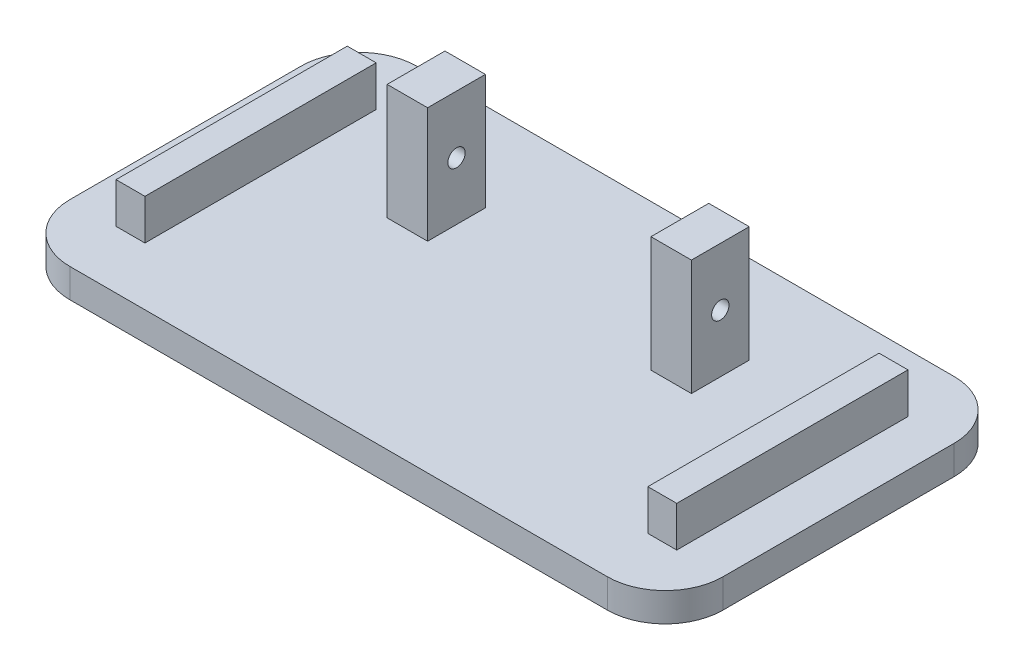
ISO-10303-21;
HEADER;
FILE_DESCRIPTION(('STEP AP214'),'2;1');
FILE_NAME('part.step','',(''),(''),'','','');
FILE_SCHEMA(('AUTOMOTIVE_DESIGN { 1 0 10303 214 1 1 1 1 }'));
ENDSEC;
DATA;
#1=APPLICATION_CONTEXT('core data for automotive mechanical design processes');
#2=APPLICATION_PROTOCOL_DEFINITION('international standard','automotive_design',2000,#1);
#3=PRODUCT_CONTEXT('',#1,'mechanical');
#4=PRODUCT('Part','Part','',(#3));
#5=PRODUCT_RELATED_PRODUCT_CATEGORY('part','',(#4));
#6=PRODUCT_DEFINITION_FORMATION('','',#4);
#7=PRODUCT_DEFINITION_CONTEXT('part definition',#1,'design');
#8=PRODUCT_DEFINITION('design','',#6,#7);
#9=PRODUCT_DEFINITION_SHAPE('','',#8);
#10=(LENGTH_UNIT() NAMED_UNIT(*) SI_UNIT(.MILLI.,.METRE.));
#11=(NAMED_UNIT(*) PLANE_ANGLE_UNIT() SI_UNIT($,.RADIAN.));
#12=(NAMED_UNIT(*) SI_UNIT($,.STERADIAN.) SOLID_ANGLE_UNIT());
#13=UNCERTAINTY_MEASURE_WITH_UNIT(LENGTH_MEASURE(1.E-05),#10,'distance_accuracy_value','');
#14=(GEOMETRIC_REPRESENTATION_CONTEXT(3) GLOBAL_UNCERTAINTY_ASSIGNED_CONTEXT((#13)) GLOBAL_UNIT_ASSIGNED_CONTEXT((#10,
#11,#12)) REPRESENTATION_CONTEXT('',''));
#15=CARTESIAN_POINT('',(0.,0.,0.));
#16=DIRECTION('',(0.,0.,1.));
#17=DIRECTION('',(1.,0.,0.));
#18=AXIS2_PLACEMENT_3D('',#15,#16,#17);
#19=CARTESIAN_POINT('',(79.785498489426,5.,-5.53323262839879));
#20=DIRECTION('',(0.,1.,0.));
#21=DIRECTION('',(0.,0.,1.));
#22=AXIS2_PLACEMENT_3D('',#19,#20,#21);
#23=PLANE('',#22);
#24=CARTESIAN_POINT('',(79.785498489426,5.,-5.53323262839879));
#25=DIRECTION('',(0.,1.,0.));
#26=DIRECTION('',(0.,0.,1.));
#27=AXIS2_PLACEMENT_3D('',#24,#25,#26);
#28=CIRCLE('',#27,10.);
#29=CARTESIAN_POINT('',(89.785498489426,5.,-5.53323262839872));
#30=VERTEX_POINT('',#29);
#31=CARTESIAN_POINT('',(79.7854984894259,5.,-15.5332326283988));
#32=VERTEX_POINT('',#31);
#33=EDGE_CURVE('E320',#30,#32,#28,.T.);
#34=ORIENTED_EDGE('',*,*,#33,.T.);
#35=DIRECTION('',(-1.,0.,0.));
#36=VECTOR('',#35,1.);
#37=CARTESIAN_POINT('',(-13.214501510574,5.,-15.5332326283988));
#38=LINE('',#37,#36);
#39=CARTESIAN_POINT('',(-13.214501510574,5.,-15.5332326283988));
#40=VERTEX_POINT('',#39);
#41=EDGE_CURVE('E323',#32,#40,#38,.T.);
#42=ORIENTED_EDGE('',*,*,#41,.T.);
#43=CARTESIAN_POINT('',(-13.214501510574,5.,-5.5332326283988));
#44=DIRECTION('',(0.,1.,0.));
#45=DIRECTION('',(0.,0.,-1.));
#46=AXIS2_PLACEMENT_3D('',#43,#44,#45);
#47=CIRCLE('',#46,10.);
#48=CARTESIAN_POINT('',(-23.214501510574,5.,-5.53323262839872));
#49=VERTEX_POINT('',#48);
#50=EDGE_CURVE('E326',#40,#49,#47,.T.);
#51=ORIENTED_EDGE('',*,*,#50,.T.);
#52=DIRECTION('',(0.,0.,1.));
#53=VECTOR('',#52,1.);
#54=CARTESIAN_POINT('',(-23.214501510574,5.,-5.53323262839872));
#55=LINE('',#54,#53);
#56=CARTESIAN_POINT('',(-23.214501510574,5.,34.4667673716011));
#57=VERTEX_POINT('',#56);
#58=EDGE_CURVE('E328',#49,#57,#55,.T.);
#59=ORIENTED_EDGE('',*,*,#58,.T.);
#60=CARTESIAN_POINT('',(-13.214501510574,5.,34.4667673716012));
#61=DIRECTION('',(0.,1.,0.));
#62=DIRECTION('',(0.,0.,-1.));
#63=AXIS2_PLACEMENT_3D('',#60,#61,#62);
#64=CIRCLE('',#63,10.);
#65=CARTESIAN_POINT('',(-13.214501510574,5.,44.4667673716012));
#66=VERTEX_POINT('',#65);
#67=EDGE_CURVE('E330',#57,#66,#64,.T.);
#68=ORIENTED_EDGE('',*,*,#67,.T.);
#69=DIRECTION('',(1.,0.,0.));
#70=VECTOR('',#69,1.);
#71=CARTESIAN_POINT('',(-13.214501510574,5.,44.4667673716012));
#72=LINE('',#71,#70);
#73=CARTESIAN_POINT('',(79.7854984894259,5.,44.4667673716012));
#74=VERTEX_POINT('',#73);
#75=EDGE_CURVE('E332',#66,#74,#72,.T.);
#76=ORIENTED_EDGE('',*,*,#75,.T.);
#77=CARTESIAN_POINT('',(79.785498489426,5.,34.4667673716012));
#78=DIRECTION('',(0.,1.,0.));
#79=DIRECTION('',(0.,0.,-1.));
#80=AXIS2_PLACEMENT_3D('',#77,#78,#79);
#81=CIRCLE('',#80,10.);
#82=CARTESIAN_POINT('',(89.785498489426,5.,34.4667673716011));
#83=VERTEX_POINT('',#82);
#84=EDGE_CURVE('E334',#74,#83,#81,.T.);
#85=ORIENTED_EDGE('',*,*,#84,.T.);
#86=DIRECTION('',(0.,0.,-1.));
#87=VECTOR('',#86,1.);
#88=CARTESIAN_POINT('',(89.785498489426,5.,-5.53323262839872));
#89=LINE('',#88,#87);
#90=EDGE_CURVE('E336',#83,#30,#89,.T.);
#91=ORIENTED_EDGE('',*,*,#90,.T.);
#92=EDGE_LOOP('',(#34,#42,#51,#59,#68,#76,#85,#91));
#93=FACE_BOUND('',#92,.T.);
#94=DIRECTION('',(1.,0.,0.));
#95=VECTOR('',#94,1.);
#96=CARTESIAN_POINT('',(6.96549848942598,5.,9.74755716237041));
#97=LINE('',#96,#95);
#98=CARTESIAN_POINT('',(6.96549848942598,5.,9.74755716237041));
#99=VERTEX_POINT('',#98);
#100=CARTESIAN_POINT('',(13.965498489426,5.,9.74755716237041));
#101=VERTEX_POINT('',#100);
#102=EDGE_CURVE('E304',#99,#101,#97,.T.);
#103=ORIENTED_EDGE('',*,*,#102,.F.);
#104=DIRECTION('',(0.,0.,1.));
#105=VECTOR('',#104,1.);
#106=CARTESIAN_POINT('',(6.96549848942598,5.,-0.252442837629588));
#107=LINE('',#106,#105);
#108=CARTESIAN_POINT('',(6.96549848942598,5.,-0.252442837629588));
#109=VERTEX_POINT('',#108);
#110=EDGE_CURVE('E290',#109,#99,#107,.T.);
#111=ORIENTED_EDGE('',*,*,#110,.F.);
#112=DIRECTION('',(-1.,0.,0.));
#113=VECTOR('',#112,1.);
#114=CARTESIAN_POINT('',(6.96549848942598,5.,-0.252442837629588));
#115=LINE('',#114,#113);
#116=CARTESIAN_POINT('',(13.965498489426,5.,-0.252442837629588));
#117=VERTEX_POINT('',#116);
#118=EDGE_CURVE('E295',#117,#109,#115,.T.);
#119=ORIENTED_EDGE('',*,*,#118,.F.);
#120=DIRECTION('',(0.,0.,-1.));
#121=VECTOR('',#120,1.);
#122=CARTESIAN_POINT('',(13.965498489426,5.,-0.252442837629588));
#123=LINE('',#122,#121);
#124=EDGE_CURVE('E306',#101,#117,#123,.T.);
#125=ORIENTED_EDGE('',*,*,#124,.F.);
#126=EDGE_LOOP('',(#103,#111,#119,#125));
#127=FACE_BOUND('',#126,.T.);
#128=DIRECTION('',(0.,0.,1.));
#129=VECTOR('',#128,1.);
#130=CARTESIAN_POINT('',(52.605498489426,5.,-0.252442837629588));
#131=LINE('',#130,#129);
#132=CARTESIAN_POINT('',(52.605498489426,5.,-0.252442837629588));
#133=VERTEX_POINT('',#132);
#134=CARTESIAN_POINT('',(52.605498489426,5.,9.74755716237041));
#135=VERTEX_POINT('',#134);
#136=EDGE_CURVE('E275',#133,#135,#131,.T.);
#137=ORIENTED_EDGE('',*,*,#136,.F.);
#138=DIRECTION('',(-1.,0.,0.));
#139=VECTOR('',#138,1.);
#140=CARTESIAN_POINT('',(52.605498489426,5.,-0.252442837629588));
#141=LINE('',#140,#139);
#142=CARTESIAN_POINT('',(59.605498489426,5.,-0.252442837629588));
#143=VERTEX_POINT('',#142);
#144=EDGE_CURVE('E261',#143,#133,#141,.T.);
#145=ORIENTED_EDGE('',*,*,#144,.F.);
#146=DIRECTION('',(0.,0.,-1.));
#147=VECTOR('',#146,1.);
#148=CARTESIAN_POINT('',(59.605498489426,5.,-0.252442837629588));
#149=LINE('',#148,#147);
#150=CARTESIAN_POINT('',(59.605498489426,5.,9.74755716237041));
#151=VERTEX_POINT('',#150);
#152=EDGE_CURVE('E266',#151,#143,#149,.T.);
#153=ORIENTED_EDGE('',*,*,#152,.F.);
#154=DIRECTION('',(1.,0.,0.));
#155=VECTOR('',#154,1.);
#156=CARTESIAN_POINT('',(52.605498489426,5.,9.74755716237041));
#157=LINE('',#156,#155);
#158=EDGE_CURVE('E277',#135,#151,#157,.T.);
#159=ORIENTED_EDGE('',*,*,#158,.F.);
#160=EDGE_LOOP('',(#137,#145,#153,#159));
#161=FACE_BOUND('',#160,.T.);
#162=DIRECTION('',(1.,0.,0.));
#163=VECTOR('',#162,1.);
#164=CARTESIAN_POINT('',(-15.214501510574,5.,34.4667673716012));
#165=LINE('',#164,#163);
#166=CARTESIAN_POINT('',(-15.214501510574,5.,34.4667673716012));
#167=VERTEX_POINT('',#166);
#168=CARTESIAN_POINT('',(-10.214501510574,5.,34.4667673716012));
#169=VERTEX_POINT('',#168);
#170=EDGE_CURVE('E224',#167,#169,#165,.T.);
#171=ORIENTED_EDGE('',*,*,#170,.F.);
#172=DIRECTION('',(0.,0.,1.));
#173=VECTOR('',#172,1.);
#174=CARTESIAN_POINT('',(-15.214501510574,5.,-5.5332326283988));
#175=LINE('',#174,#173);
#176=CARTESIAN_POINT('',(-15.214501510574,5.,-5.5332326283988));
#177=VERTEX_POINT('',#176);
#178=EDGE_CURVE('E221',#177,#167,#175,.T.);
#179=ORIENTED_EDGE('',*,*,#178,.F.);
#180=DIRECTION('',(-1.,0.,0.));
#181=VECTOR('',#180,1.);
#182=CARTESIAN_POINT('',(-15.214501510574,5.,-5.5332326283988));
#183=LINE('',#182,#181);
#184=CARTESIAN_POINT('',(-10.214501510574,5.,-5.5332326283988));
#185=VERTEX_POINT('',#184);
#186=EDGE_CURVE('E233',#185,#177,#183,.T.);
#187=ORIENTED_EDGE('',*,*,#186,.F.);
#188=DIRECTION('',(0.,0.,-1.));
#189=VECTOR('',#188,1.);
#190=CARTESIAN_POINT('',(-10.214501510574,5.,-5.5332326283988));
#191=LINE('',#190,#189);
#192=EDGE_CURVE('E241',#169,#185,#191,.T.);
#193=ORIENTED_EDGE('',*,*,#192,.F.);
#194=EDGE_LOOP('',(#171,#179,#187,#193));
#195=FACE_BOUND('',#194,.T.);
#196=DIRECTION('',(1.,0.,0.));
#197=VECTOR('',#196,1.);
#198=CARTESIAN_POINT('',(76.785498489426,5.,34.4667673716012));
#199=LINE('',#198,#197);
#200=CARTESIAN_POINT('',(76.785498489426,5.,34.4667673716012));
#201=VERTEX_POINT('',#200);
#202=CARTESIAN_POINT('',(81.785498489426,5.,34.4667673716012));
#203=VERTEX_POINT('',#202);
#204=EDGE_CURVE('E709',#201,#203,#199,.T.);
#205=ORIENTED_EDGE('',*,*,#204,.F.);
#206=DIRECTION('',(0.,0.,1.));
#207=VECTOR('',#206,1.);
#208=CARTESIAN_POINT('',(76.7854984894259,5.,-5.5332326283988));
#209=LINE('',#208,#207);
#210=CARTESIAN_POINT('',(76.7854984894259,5.,-5.5332326283988));
#211=VERTEX_POINT('',#210);
#212=EDGE_CURVE('E219',#211,#201,#209,.T.);
#213=ORIENTED_EDGE('',*,*,#212,.F.);
#214=DIRECTION('',(-1.,0.,0.));
#215=VECTOR('',#214,1.);
#216=CARTESIAN_POINT('',(76.7854984894259,5.,-5.5332326283988));
#217=LINE('',#216,#215);
#218=CARTESIAN_POINT('',(81.785498489426,5.,-5.5332326283988));
#219=VERTEX_POINT('',#218);
#220=EDGE_CURVE('E215',#219,#211,#217,.T.);
#221=ORIENTED_EDGE('',*,*,#220,.F.);
#222=DIRECTION('',(0.,0.,-1.));
#223=VECTOR('',#222,1.);
#224=CARTESIAN_POINT('',(81.785498489426,5.,-5.5332326283988));
#225=LINE('',#224,#223);
#226=EDGE_CURVE('E706',#203,#219,#225,.T.);
#227=ORIENTED_EDGE('',*,*,#226,.F.);
#228=EDGE_LOOP('',(#205,#213,#221,#227));
#229=FACE_BOUND('',#228,.T.);
#230=ADVANCED_FACE('F33',(#93,#127,#161,#195,#229),#23,.T.);
#231=CARTESIAN_POINT('',(79.785498489426,5.,-5.53323262839879));
#232=DIRECTION('',(0.,-1.,0.));
#233=DIRECTION('',(0.,0.,-1.));
#234=AXIS2_PLACEMENT_3D('',#231,#232,#233);
#235=CYLINDRICAL_SURFACE('',#234,10.);
#236=CARTESIAN_POINT('',(79.785498489426,0.,-5.53323262839879));
#237=DIRECTION('',(0.,1.,0.));
#238=DIRECTION('',(0.,0.,1.));
#239=AXIS2_PLACEMENT_3D('',#236,#237,#238);
#240=CIRCLE('',#239,10.);
#241=CARTESIAN_POINT('',(89.785498489426,0.,-5.53323262839872));
#242=VERTEX_POINT('',#241);
#243=CARTESIAN_POINT('',(79.7854984894259,0.,-15.5332326283988));
#244=VERTEX_POINT('',#243);
#245=EDGE_CURVE('E319',#242,#244,#240,.T.);
#246=ORIENTED_EDGE('',*,*,#245,.T.);
#247=DIRECTION('',(0.,-1.,0.));
#248=VECTOR('',#247,1.);
#249=CARTESIAN_POINT('',(79.7854984894259,5.,-15.5332326283988));
#250=LINE('',#249,#248);
#251=EDGE_CURVE('E11',#32,#244,#250,.T.);
#252=ORIENTED_EDGE('',*,*,#251,.F.);
#253=ORIENTED_EDGE('',*,*,#33,.F.);
#254=DIRECTION('',(0.,-1.,0.));
#255=VECTOR('',#254,1.);
#256=CARTESIAN_POINT('',(89.785498489426,5.,-5.53323262839872));
#257=LINE('',#256,#255);
#258=EDGE_CURVE('E338',#30,#242,#257,.T.);
#259=ORIENTED_EDGE('',*,*,#258,.T.);
#260=EDGE_LOOP('',(#246,#252,#253,#259));
#261=FACE_BOUND('',#260,.T.);
#262=ADVANCED_FACE('F35',(#261),#235,.T.);
#263=CARTESIAN_POINT('',(-13.214501510574,5.,-15.5332326283988));
#264=DIRECTION('',(0.,0.,1.));
#265=DIRECTION('',(1.,0.,0.));
#266=AXIS2_PLACEMENT_3D('',#263,#264,#265);
#267=PLANE('',#266);
#268=DIRECTION('',(-1.,0.,0.));
#269=VECTOR('',#268,1.);
#270=CARTESIAN_POINT('',(-13.214501510574,0.,-15.5332326283988));
#271=LINE('',#270,#269);
#272=CARTESIAN_POINT('',(-13.214501510574,0.,-15.5332326283988));
#273=VERTEX_POINT('',#272);
#274=EDGE_CURVE('E341',#244,#273,#271,.T.);
#275=ORIENTED_EDGE('',*,*,#274,.T.);
#276=DIRECTION('',(0.,-1.,0.));
#277=VECTOR('',#276,1.);
#278=CARTESIAN_POINT('',(-13.214501510574,5.,-15.5332326283988));
#279=LINE('',#278,#277);
#280=EDGE_CURVE('E42',#40,#273,#279,.T.);
#281=ORIENTED_EDGE('',*,*,#280,.F.);
#282=ORIENTED_EDGE('',*,*,#41,.F.);
#283=ORIENTED_EDGE('',*,*,#251,.T.);
#284=EDGE_LOOP('',(#275,#281,#282,#283));
#285=FACE_BOUND('',#284,.T.);
#286=ADVANCED_FACE('F399',(#285),#267,.F.);
#287=CARTESIAN_POINT('',(-13.214501510574,5.,-5.5332326283988));
#288=DIRECTION('',(0.,-1.,0.));
#289=DIRECTION('',(0.,0.,-1.));
#290=AXIS2_PLACEMENT_3D('',#287,#288,#289);
#291=CYLINDRICAL_SURFACE('',#290,10.);
#292=CARTESIAN_POINT('',(-13.214501510574,0.,-5.5332326283988));
#293=DIRECTION('',(0.,1.,0.));
#294=DIRECTION('',(0.,0.,-1.));
#295=AXIS2_PLACEMENT_3D('',#292,#293,#294);
#296=CIRCLE('',#295,10.);
#297=CARTESIAN_POINT('',(-23.214501510574,0.,-5.53323262839872));
#298=VERTEX_POINT('',#297);
#299=EDGE_CURVE('E343',#273,#298,#296,.T.);
#300=ORIENTED_EDGE('',*,*,#299,.T.);
#301=DIRECTION('',(0.,-1.,0.));
#302=VECTOR('',#301,1.);
#303=CARTESIAN_POINT('',(-23.214501510574,5.,-5.53323262839872));
#304=LINE('',#303,#302);
#305=EDGE_CURVE('E368',#49,#298,#304,.T.);
#306=ORIENTED_EDGE('',*,*,#305,.F.);
#307=ORIENTED_EDGE('',*,*,#50,.F.);
#308=ORIENTED_EDGE('',*,*,#280,.T.);
#309=EDGE_LOOP('',(#300,#306,#307,#308));
#310=FACE_BOUND('',#309,.T.);
#311=ADVANCED_FACE('F376',(#310),#291,.T.);
#312=CARTESIAN_POINT('',(-23.214501510574,5.,-5.53323262839872));
#313=DIRECTION('',(1.,0.,0.));
#314=DIRECTION('',(0.,0.,-1.));
#315=AXIS2_PLACEMENT_3D('',#312,#313,#314);
#316=PLANE('',#315);
#317=DIRECTION('',(0.,0.,1.));
#318=VECTOR('',#317,1.);
#319=CARTESIAN_POINT('',(-23.214501510574,0.,-5.53323262839872));
#320=LINE('',#319,#318);
#321=CARTESIAN_POINT('',(-23.214501510574,0.,34.4667673716011));
#322=VERTEX_POINT('',#321);
#323=EDGE_CURVE('E345',#298,#322,#320,.T.);
#324=ORIENTED_EDGE('',*,*,#323,.T.);
#325=DIRECTION('',(0.,-1.,0.));
#326=VECTOR('',#325,1.);
#327=CARTESIAN_POINT('',(-23.214501510574,5.,34.4667673716011));
#328=LINE('',#327,#326);
#329=EDGE_CURVE('E365',#57,#322,#328,.T.);
#330=ORIENTED_EDGE('',*,*,#329,.F.);
#331=ORIENTED_EDGE('',*,*,#58,.F.);
#332=ORIENTED_EDGE('',*,*,#305,.T.);
#333=EDGE_LOOP('',(#324,#330,#331,#332));
#334=FACE_BOUND('',#333,.T.);
#335=ADVANCED_FACE('F387',(#334),#316,.F.);
#336=CARTESIAN_POINT('',(-13.214501510574,5.,34.4667673716012));
#337=DIRECTION('',(0.,-1.,0.));
#338=DIRECTION('',(0.,0.,-1.));
#339=AXIS2_PLACEMENT_3D('',#336,#337,#338);
#340=CYLINDRICAL_SURFACE('',#339,10.);
#341=CARTESIAN_POINT('',(-13.214501510574,0.,34.4667673716012));
#342=DIRECTION('',(0.,1.,0.));
#343=DIRECTION('',(0.,0.,-1.));
#344=AXIS2_PLACEMENT_3D('',#341,#342,#343);
#345=CIRCLE('',#344,10.);
#346=CARTESIAN_POINT('',(-13.214501510574,0.,44.4667673716012));
#347=VERTEX_POINT('',#346);
#348=EDGE_CURVE('E347',#322,#347,#345,.T.);
#349=ORIENTED_EDGE('',*,*,#348,.T.);
#350=DIRECTION('',(0.,-1.,0.));
#351=VECTOR('',#350,1.);
#352=CARTESIAN_POINT('',(-13.214501510574,5.,44.4667673716012));
#353=LINE('',#352,#351);
#354=EDGE_CURVE('E362',#66,#347,#353,.T.);
#355=ORIENTED_EDGE('',*,*,#354,.F.);
#356=ORIENTED_EDGE('',*,*,#67,.F.);
#357=ORIENTED_EDGE('',*,*,#329,.T.);
#358=EDGE_LOOP('',(#349,#355,#356,#357));
#359=FACE_BOUND('',#358,.T.);
#360=ADVANCED_FACE('F391',(#359),#340,.T.);
#361=CARTESIAN_POINT('',(-13.214501510574,5.,44.4667673716012));
#362=DIRECTION('',(0.,0.,-1.));
#363=DIRECTION('',(-1.,0.,0.));
#364=AXIS2_PLACEMENT_3D('',#361,#362,#363);
#365=PLANE('',#364);
#366=DIRECTION('',(1.,0.,0.));
#367=VECTOR('',#366,1.);
#368=CARTESIAN_POINT('',(-13.214501510574,0.,44.4667673716012));
#369=LINE('',#368,#367);
#370=CARTESIAN_POINT('',(79.7854984894259,0.,44.4667673716012));
#371=VERTEX_POINT('',#370);
#372=EDGE_CURVE('E349',#347,#371,#369,.T.);
#373=ORIENTED_EDGE('',*,*,#372,.T.);
#374=DIRECTION('',(0.,-1.,0.));
#375=VECTOR('',#374,1.);
#376=CARTESIAN_POINT('',(79.7854984894259,5.,44.4667673716012));
#377=LINE('',#376,#375);
#378=EDGE_CURVE('E359',#74,#371,#377,.T.);
#379=ORIENTED_EDGE('',*,*,#378,.F.);
#380=ORIENTED_EDGE('',*,*,#75,.F.);
#381=ORIENTED_EDGE('',*,*,#354,.T.);
#382=EDGE_LOOP('',(#373,#379,#380,#381));
#383=FACE_BOUND('',#382,.T.);
#384=ADVANCED_FACE('F412',(#383),#365,.F.);
#385=CARTESIAN_POINT('',(79.785498489426,5.,34.4667673716012));
#386=DIRECTION('',(0.,-1.,0.));
#387=DIRECTION('',(0.,0.,-1.));
#388=AXIS2_PLACEMENT_3D('',#385,#386,#387);
#389=CYLINDRICAL_SURFACE('',#388,10.);
#390=CARTESIAN_POINT('',(79.785498489426,0.,34.4667673716012));
#391=DIRECTION('',(0.,1.,0.));
#392=DIRECTION('',(0.,0.,-1.));
#393=AXIS2_PLACEMENT_3D('',#390,#391,#392);
#394=CIRCLE('',#393,10.);
#395=CARTESIAN_POINT('',(89.785498489426,0.,34.4667673716011));
#396=VERTEX_POINT('',#395);
#397=EDGE_CURVE('E351',#371,#396,#394,.T.);
#398=ORIENTED_EDGE('',*,*,#397,.T.);
#399=DIRECTION('',(0.,-1.,0.));
#400=VECTOR('',#399,1.);
#401=CARTESIAN_POINT('',(89.785498489426,5.,34.4667673716011));
#402=LINE('',#401,#400);
#403=EDGE_CURVE('E356',#83,#396,#402,.T.);
#404=ORIENTED_EDGE('',*,*,#403,.F.);
#405=ORIENTED_EDGE('',*,*,#84,.F.);
#406=ORIENTED_EDGE('',*,*,#378,.T.);
#407=EDGE_LOOP('',(#398,#404,#405,#406));
#408=FACE_BOUND('',#407,.T.);
#409=ADVANCED_FACE('F410',(#408),#389,.T.);
#410=CARTESIAN_POINT('',(89.785498489426,5.,-5.53323262839872));
#411=DIRECTION('',(-1.,0.,0.));
#412=DIRECTION('',(0.,0.,1.));
#413=AXIS2_PLACEMENT_3D('',#410,#411,#412);
#414=PLANE('',#413);
#415=DIRECTION('',(0.,0.,-1.));
#416=VECTOR('',#415,1.);
#417=CARTESIAN_POINT('',(89.785498489426,0.,-5.53323262839872));
#418=LINE('',#417,#416);
#419=EDGE_CURVE('E324',#396,#242,#418,.T.);
#420=ORIENTED_EDGE('',*,*,#419,.T.);
#421=ORIENTED_EDGE('',*,*,#258,.F.);
#422=ORIENTED_EDGE('',*,*,#90,.F.);
#423=ORIENTED_EDGE('',*,*,#403,.T.);
#424=EDGE_LOOP('',(#420,#421,#422,#423));
#425=FACE_BOUND('',#424,.T.);
#426=ADVANCED_FACE('F405',(#425),#414,.F.);
#427=CARTESIAN_POINT('',(79.785498489426,0.,-5.53323262839879));
#428=DIRECTION('',(0.,1.,0.));
#429=DIRECTION('',(0.,0.,1.));
#430=AXIS2_PLACEMENT_3D('',#427,#428,#429);
#431=PLANE('',#430);
#432=ORIENTED_EDGE('',*,*,#245,.F.);
#433=ORIENTED_EDGE('',*,*,#419,.F.);
#434=ORIENTED_EDGE('',*,*,#397,.F.);
#435=ORIENTED_EDGE('',*,*,#372,.F.);
#436=ORIENTED_EDGE('',*,*,#348,.F.);
#437=ORIENTED_EDGE('',*,*,#323,.F.);
#438=ORIENTED_EDGE('',*,*,#299,.F.);
#439=ORIENTED_EDGE('',*,*,#274,.F.);
#440=EDGE_LOOP('',(#432,#433,#434,#435,#436,#437,#438,#439));
#441=FACE_BOUND('',#440,.T.);
#442=ADVANCED_FACE('F382',(#441),#431,.F.);
#443=CARTESIAN_POINT('',(6.96549848942598,25.,-0.252442837629588));
#444=DIRECTION('',(1.,0.,0.));
#445=DIRECTION('',(0.,0.,-1.));
#446=AXIS2_PLACEMENT_3D('',#443,#444,#445);
#447=PLANE('',#446);
#448=CARTESIAN_POINT('',(6.96549848942598,15.,4.74755716237041));
#449=DIRECTION('',(-1.,0.,0.));
#450=DIRECTION('',(0.,0.,1.));
#451=AXIS2_PLACEMENT_3D('',#448,#449,#450);
#452=CIRCLE('',#451,1.5);
#453=CARTESIAN_POINT('',(6.96549848942597,15.,6.24755716237041));
#454=VERTEX_POINT('',#453);
#455=EDGE_CURVE('E252',#454,#454,#452,.T.);
#456=ORIENTED_EDGE('',*,*,#455,.F.);
#457=EDGE_LOOP('',(#456));
#458=FACE_BOUND('',#457,.T.);
#459=ORIENTED_EDGE('',*,*,#110,.T.);
#460=DIRECTION('',(0.,-1.,0.));
#461=VECTOR('',#460,1.);
#462=CARTESIAN_POINT('',(6.96549848942598,25.,9.74755716237041));
#463=LINE('',#462,#461);
#464=CARTESIAN_POINT('',(6.96549848942598,25.,9.74755716237041));
#465=VERTEX_POINT('',#464);
#466=EDGE_CURVE('E317',#465,#99,#463,.T.);
#467=ORIENTED_EDGE('',*,*,#466,.F.);
#468=DIRECTION('',(0.,0.,1.));
#469=VECTOR('',#468,1.);
#470=CARTESIAN_POINT('',(6.96549848942598,25.,-0.252442837629588));
#471=LINE('',#470,#469);
#472=CARTESIAN_POINT('',(6.96549848942598,25.,-0.252442837629588));
#473=VERTEX_POINT('',#472);
#474=EDGE_CURVE('E291',#473,#465,#471,.T.);
#475=ORIENTED_EDGE('',*,*,#474,.F.);
#476=DIRECTION('',(0.,-1.,0.));
#477=VECTOR('',#476,1.);
#478=CARTESIAN_POINT('',(6.96549848942598,25.,-0.252442837629588));
#479=LINE('',#478,#477);
#480=EDGE_CURVE('E301',#473,#109,#479,.T.);
#481=ORIENTED_EDGE('',*,*,#480,.T.);
#482=EDGE_LOOP('',(#459,#467,#475,#481));
#483=FACE_BOUND('',#482,.T.);
#484=ADVANCED_FACE('F428',(#458,#483),#447,.F.);
#485=CARTESIAN_POINT('',(6.96549848942598,25.,9.74755716237041));
#486=DIRECTION('',(0.,0.,-1.));
#487=DIRECTION('',(-1.,0.,0.));
#488=AXIS2_PLACEMENT_3D('',#485,#486,#487);
#489=PLANE('',#488);
#490=ORIENTED_EDGE('',*,*,#102,.T.);
#491=DIRECTION('',(0.,-1.,0.));
#492=VECTOR('',#491,1.);
#493=CARTESIAN_POINT('',(13.965498489426,25.,9.74755716237041));
#494=LINE('',#493,#492);
#495=CARTESIAN_POINT('',(13.965498489426,25.,9.74755716237041));
#496=VERTEX_POINT('',#495);
#497=EDGE_CURVE('E314',#496,#101,#494,.T.);
#498=ORIENTED_EDGE('',*,*,#497,.F.);
#499=DIRECTION('',(1.,0.,0.));
#500=VECTOR('',#499,1.);
#501=CARTESIAN_POINT('',(6.96549848942598,25.,9.74755716237041));
#502=LINE('',#501,#500);
#503=EDGE_CURVE('E294',#465,#496,#502,.T.);
#504=ORIENTED_EDGE('',*,*,#503,.F.);
#505=ORIENTED_EDGE('',*,*,#466,.T.);
#506=EDGE_LOOP('',(#490,#498,#504,#505));
#507=FACE_BOUND('',#506,.T.);
#508=ADVANCED_FACE('F448',(#507),#489,.F.);
#509=CARTESIAN_POINT('',(13.965498489426,25.,-0.252442837629588));
#510=DIRECTION('',(-1.,0.,0.));
#511=DIRECTION('',(0.,0.,1.));
#512=AXIS2_PLACEMENT_3D('',#509,#510,#511);
#513=PLANE('',#512);
#514=CARTESIAN_POINT('',(13.965498489426,15.,4.74755716237041));
#515=DIRECTION('',(-1.,0.,0.));
#516=DIRECTION('',(0.,0.,1.));
#517=AXIS2_PLACEMENT_3D('',#514,#515,#516);
#518=CIRCLE('',#517,1.5);
#519=CARTESIAN_POINT('',(13.965498489426,15.,6.24755716237041));
#520=VERTEX_POINT('',#519);
#521=EDGE_CURVE('E258',#520,#520,#518,.T.);
#522=ORIENTED_EDGE('',*,*,#521,.T.);
#523=EDGE_LOOP('',(#522));
#524=FACE_BOUND('',#523,.T.);
#525=ORIENTED_EDGE('',*,*,#124,.T.);
#526=DIRECTION('',(0.,-1.,0.));
#527=VECTOR('',#526,1.);
#528=CARTESIAN_POINT('',(13.965498489426,25.,-0.252442837629588));
#529=LINE('',#528,#527);
#530=CARTESIAN_POINT('',(13.965498489426,25.,-0.252442837629588));
#531=VERTEX_POINT('',#530);
#532=EDGE_CURVE('E312',#531,#117,#529,.T.);
#533=ORIENTED_EDGE('',*,*,#532,.F.);
#534=DIRECTION('',(0.,0.,-1.));
#535=VECTOR('',#534,1.);
#536=CARTESIAN_POINT('',(13.965498489426,25.,-0.252442837629588));
#537=LINE('',#536,#535);
#538=EDGE_CURVE('E297',#496,#531,#537,.T.);
#539=ORIENTED_EDGE('',*,*,#538,.F.);
#540=ORIENTED_EDGE('',*,*,#497,.T.);
#541=EDGE_LOOP('',(#525,#533,#539,#540));
#542=FACE_BOUND('',#541,.T.);
#543=ADVANCED_FACE('F456',(#524,#542),#513,.F.);
#544=CARTESIAN_POINT('',(6.96549848942598,25.,-0.252442837629588));
#545=DIRECTION('',(0.,0.,1.));
#546=DIRECTION('',(1.,0.,0.));
#547=AXIS2_PLACEMENT_3D('',#544,#545,#546);
#548=PLANE('',#547);
#549=ORIENTED_EDGE('',*,*,#118,.T.);
#550=ORIENTED_EDGE('',*,*,#480,.F.);
#551=DIRECTION('',(-1.,0.,0.));
#552=VECTOR('',#551,1.);
#553=CARTESIAN_POINT('',(6.96549848942598,25.,-0.252442837629588));
#554=LINE('',#553,#552);
#555=EDGE_CURVE('E299',#531,#473,#554,.T.);
#556=ORIENTED_EDGE('',*,*,#555,.F.);
#557=ORIENTED_EDGE('',*,*,#532,.T.);
#558=EDGE_LOOP('',(#549,#550,#556,#557));
#559=FACE_BOUND('',#558,.T.);
#560=ADVANCED_FACE('F463',(#559),#548,.F.);
#561=CARTESIAN_POINT('',(0.,25.,0.));
#562=DIRECTION('',(0.,1.,0.));
#563=DIRECTION('',(0.,0.,1.));
#564=AXIS2_PLACEMENT_3D('',#561,#562,#563);
#565=PLANE('',#564);
#566=ORIENTED_EDGE('',*,*,#474,.T.);
#567=ORIENTED_EDGE('',*,*,#503,.T.);
#568=ORIENTED_EDGE('',*,*,#538,.T.);
#569=ORIENTED_EDGE('',*,*,#555,.T.);
#570=EDGE_LOOP('',(#566,#567,#568,#569));
#571=FACE_BOUND('',#570,.T.);
#572=ADVANCED_FACE('F471',(#571),#565,.T.);
#573=CARTESIAN_POINT('',(52.605498489426,25.,-0.252442837629588));
#574=DIRECTION('',(0.,0.,1.));
#575=DIRECTION('',(1.,0.,0.));
#576=AXIS2_PLACEMENT_3D('',#573,#574,#575);
#577=PLANE('',#576);
#578=ORIENTED_EDGE('',*,*,#144,.T.);
#579=DIRECTION('',(0.,-1.,0.));
#580=VECTOR('',#579,1.);
#581=CARTESIAN_POINT('',(52.605498489426,25.,-0.252442837629588));
#582=LINE('',#581,#580);
#583=CARTESIAN_POINT('',(52.605498489426,25.,-0.252442837629588));
#584=VERTEX_POINT('',#583);
#585=EDGE_CURVE('E288',#584,#133,#582,.T.);
#586=ORIENTED_EDGE('',*,*,#585,.F.);
#587=DIRECTION('',(-1.,0.,0.));
#588=VECTOR('',#587,1.);
#589=CARTESIAN_POINT('',(52.605498489426,25.,-0.252442837629588));
#590=LINE('',#589,#588);
#591=CARTESIAN_POINT('',(59.605498489426,25.,-0.252442837629588));
#592=VERTEX_POINT('',#591);
#593=EDGE_CURVE('E262',#592,#584,#590,.T.);
#594=ORIENTED_EDGE('',*,*,#593,.F.);
#595=DIRECTION('',(0.,-1.,0.));
#596=VECTOR('',#595,1.);
#597=CARTESIAN_POINT('',(59.605498489426,25.,-0.252442837629588));
#598=LINE('',#597,#596);
#599=EDGE_CURVE('E272',#592,#143,#598,.T.);
#600=ORIENTED_EDGE('',*,*,#599,.T.);
#601=EDGE_LOOP('',(#578,#586,#594,#600));
#602=FACE_BOUND('',#601,.T.);
#603=ADVANCED_FACE('F479',(#602),#577,.F.);
#604=CARTESIAN_POINT('',(52.605498489426,25.,-0.252442837629588));
#605=DIRECTION('',(1.,0.,0.));
#606=DIRECTION('',(0.,0.,-1.));
#607=AXIS2_PLACEMENT_3D('',#604,#605,#606);
#608=PLANE('',#607);
#609=CARTESIAN_POINT('',(52.605498489426,15.,4.74755716237041));
#610=DIRECTION('',(1.,0.,0.));
#611=DIRECTION('',(0.,0.,-1.));
#612=AXIS2_PLACEMENT_3D('',#609,#610,#611);
#613=CIRCLE('',#612,1.5);
#614=CARTESIAN_POINT('',(52.605498489426,15.,6.24755716237041));
#615=VERTEX_POINT('',#614);
#616=EDGE_CURVE('E255',#615,#615,#613,.T.);
#617=ORIENTED_EDGE('',*,*,#616,.T.);
#618=EDGE_LOOP('',(#617));
#619=FACE_BOUND('',#618,.T.);
#620=ORIENTED_EDGE('',*,*,#136,.T.);
#621=DIRECTION('',(0.,-1.,0.));
#622=VECTOR('',#621,1.);
#623=CARTESIAN_POINT('',(52.605498489426,25.,9.74755716237041));
#624=LINE('',#623,#622);
#625=CARTESIAN_POINT('',(52.605498489426,25.,9.74755716237041));
#626=VERTEX_POINT('',#625);
#627=EDGE_CURVE('E285',#626,#135,#624,.T.);
#628=ORIENTED_EDGE('',*,*,#627,.F.);
#629=DIRECTION('',(0.,0.,1.));
#630=VECTOR('',#629,1.);
#631=CARTESIAN_POINT('',(52.605498489426,25.,-0.252442837629588));
#632=LINE('',#631,#630);
#633=EDGE_CURVE('E265',#584,#626,#632,.T.);
#634=ORIENTED_EDGE('',*,*,#633,.F.);
#635=ORIENTED_EDGE('',*,*,#585,.T.);
#636=EDGE_LOOP('',(#620,#628,#634,#635));
#637=FACE_BOUND('',#636,.T.);
#638=ADVANCED_FACE('F487',(#619,#637),#608,.F.);
#639=CARTESIAN_POINT('',(52.605498489426,25.,9.74755716237041));
#640=DIRECTION('',(0.,0.,-1.));
#641=DIRECTION('',(-1.,0.,0.));
#642=AXIS2_PLACEMENT_3D('',#639,#640,#641);
#643=PLANE('',#642);
#644=ORIENTED_EDGE('',*,*,#158,.T.);
#645=DIRECTION('',(0.,-1.,0.));
#646=VECTOR('',#645,1.);
#647=CARTESIAN_POINT('',(59.605498489426,25.,9.74755716237041));
#648=LINE('',#647,#646);
#649=CARTESIAN_POINT('',(59.605498489426,25.,9.74755716237041));
#650=VERTEX_POINT('',#649);
#651=EDGE_CURVE('E283',#650,#151,#648,.T.);
#652=ORIENTED_EDGE('',*,*,#651,.F.);
#653=DIRECTION('',(1.,0.,0.));
#654=VECTOR('',#653,1.);
#655=CARTESIAN_POINT('',(52.605498489426,25.,9.74755716237041));
#656=LINE('',#655,#654);
#657=EDGE_CURVE('E268',#626,#650,#656,.T.);
#658=ORIENTED_EDGE('',*,*,#657,.F.);
#659=ORIENTED_EDGE('',*,*,#627,.T.);
#660=EDGE_LOOP('',(#644,#652,#658,#659));
#661=FACE_BOUND('',#660,.T.);
#662=ADVANCED_FACE('F495',(#661),#643,.F.);
#663=CARTESIAN_POINT('',(59.605498489426,25.,-0.252442837629588));
#664=DIRECTION('',(-1.,0.,0.));
#665=DIRECTION('',(0.,0.,1.));
#666=AXIS2_PLACEMENT_3D('',#663,#664,#665);
#667=PLANE('',#666);
#668=CARTESIAN_POINT('',(59.605498489426,15.,4.74755716237041));
#669=DIRECTION('',(-1.,0.,0.));
#670=DIRECTION('',(0.,0.,1.));
#671=AXIS2_PLACEMENT_3D('',#668,#669,#670);
#672=CIRCLE('',#671,1.5);
#673=CARTESIAN_POINT('',(59.605498489426,15.,6.24755716237041));
#674=VERTEX_POINT('',#673);
#675=EDGE_CURVE('E37',#674,#674,#672,.T.);
#676=ORIENTED_EDGE('',*,*,#675,.T.);
#677=EDGE_LOOP('',(#676));
#678=FACE_BOUND('',#677,.T.);
#679=ORIENTED_EDGE('',*,*,#152,.T.);
#680=ORIENTED_EDGE('',*,*,#599,.F.);
#681=DIRECTION('',(0.,0.,-1.));
#682=VECTOR('',#681,1.);
#683=CARTESIAN_POINT('',(59.605498489426,25.,-0.252442837629588));
#684=LINE('',#683,#682);
#685=EDGE_CURVE('E270',#650,#592,#684,.T.);
#686=ORIENTED_EDGE('',*,*,#685,.F.);
#687=ORIENTED_EDGE('',*,*,#651,.T.);
#688=EDGE_LOOP('',(#679,#680,#686,#687));
#689=FACE_BOUND('',#688,.T.);
#690=ADVANCED_FACE('F503',(#678,#689),#667,.F.);
#691=CARTESIAN_POINT('',(0.,25.,0.));
#692=DIRECTION('',(0.,-1.,0.));
#693=DIRECTION('',(0.,0.,-1.));
#694=AXIS2_PLACEMENT_3D('',#691,#692,#693);
#695=PLANE('',#694);
#696=ORIENTED_EDGE('',*,*,#593,.T.);
#697=ORIENTED_EDGE('',*,*,#633,.T.);
#698=ORIENTED_EDGE('',*,*,#657,.T.);
#699=ORIENTED_EDGE('',*,*,#685,.T.);
#700=EDGE_LOOP('',(#696,#697,#698,#699));
#701=FACE_BOUND('',#700,.T.);
#702=ADVANCED_FACE('F510',(#701),#695,.F.);
#703=CARTESIAN_POINT('',(89.785498489426,15.,4.7475571623704));
#704=DIRECTION('',(-1.,0.,0.));
#705=DIRECTION('',(0.,0.,1.));
#706=AXIS2_PLACEMENT_3D('',#703,#704,#705);
#707=CYLINDRICAL_SURFACE('',#706,1.5);
#708=CARTESIAN_POINT('',(59.605498489426,15.,6.24755716237041));
#709=CARTESIAN_POINT('',(59.5325818227593,15.,6.24755716237041));
#710=CARTESIAN_POINT('',(59.4596651560927,15.,6.24755716237041));
#711=CARTESIAN_POINT('',(59.3138318227593,15.,6.24755716237041));
#712=CARTESIAN_POINT('',(59.2409151560927,15.,6.24755716237041));
#713=CARTESIAN_POINT('',(59.0950818227593,15.,6.24755716237041));
#714=CARTESIAN_POINT('',(59.0221651560927,15.,6.24755716237041));
#715=CARTESIAN_POINT('',(58.8763318227593,15.,6.24755716237041));
#716=CARTESIAN_POINT('',(58.8034151560927,15.,6.24755716237041));
#717=CARTESIAN_POINT('',(58.6575818227593,15.,6.24755716237041));
#718=CARTESIAN_POINT('',(58.5846651560927,15.,6.24755716237041));
#719=CARTESIAN_POINT('',(58.4388318227593,15.,6.24755716237041));
#720=CARTESIAN_POINT('',(58.3659151560927,15.,6.24755716237041));
#721=CARTESIAN_POINT('',(58.2200818227593,15.,6.24755716237041));
#722=CARTESIAN_POINT('',(58.1471651560927,15.,6.24755716237041));
#723=CARTESIAN_POINT('',(58.0013318227593,15.,6.24755716237041));
#724=CARTESIAN_POINT('',(57.9284151560927,15.,6.24755716237041));
#725=CARTESIAN_POINT('',(57.7825818227593,15.,6.24755716237041));
#726=CARTESIAN_POINT('',(57.7096651560927,15.,6.24755716237041));
#727=CARTESIAN_POINT('',(57.5638318227593,15.,6.24755716237041));
#728=CARTESIAN_POINT('',(57.4909151560927,15.,6.24755716237041));
#729=CARTESIAN_POINT('',(57.3450818227593,15.,6.24755716237041));
#730=CARTESIAN_POINT('',(57.2721651560927,15.,6.24755716237041));
#731=CARTESIAN_POINT('',(57.1263318227593,15.,6.24755716237041));
#732=CARTESIAN_POINT('',(57.0534151560927,15.,6.24755716237041));
#733=CARTESIAN_POINT('',(56.9075818227593,15.,6.24755716237041));
#734=CARTESIAN_POINT('',(56.8346651560927,15.,6.24755716237041));
#735=CARTESIAN_POINT('',(56.6888318227593,15.,6.24755716237041));
#736=CARTESIAN_POINT('',(56.6159151560927,15.,6.24755716237041));
#737=CARTESIAN_POINT('',(56.4700818227593,15.,6.24755716237041));
#738=CARTESIAN_POINT('',(56.3971651560927,15.,6.24755716237041));
#739=CARTESIAN_POINT('',(56.2513318227593,15.,6.24755716237041));
#740=CARTESIAN_POINT('',(56.1784151560927,15.,6.24755716237041));
#741=CARTESIAN_POINT('',(56.0325818227593,15.,6.24755716237041));
#742=CARTESIAN_POINT('',(55.9596651560927,15.,6.24755716237041));
#743=CARTESIAN_POINT('',(55.8138318227593,15.,6.24755716237041));
#744=CARTESIAN_POINT('',(55.7409151560927,15.,6.24755716237041));
#745=CARTESIAN_POINT('',(55.5950818227593,15.,6.24755716237041));
#746=CARTESIAN_POINT('',(55.5221651560927,15.,6.24755716237041));
#747=CARTESIAN_POINT('',(55.3763318227593,15.,6.24755716237041));
#748=CARTESIAN_POINT('',(55.3034151560927,15.,6.24755716237041));
#749=CARTESIAN_POINT('',(55.1575818227593,15.,6.24755716237041));
#750=CARTESIAN_POINT('',(55.0846651560927,15.,6.24755716237041));
#751=CARTESIAN_POINT('',(54.9388318227593,15.,6.24755716237041));
#752=CARTESIAN_POINT('',(54.8659151560927,15.,6.24755716237041));
#753=CARTESIAN_POINT('',(54.7200818227593,15.,6.24755716237041));
#754=CARTESIAN_POINT('',(54.6471651560927,15.,6.24755716237041));
#755=CARTESIAN_POINT('',(54.5013318227593,15.,6.24755716237041));
#756=CARTESIAN_POINT('',(54.4284151560927,15.,6.24755716237041));
#757=CARTESIAN_POINT('',(54.2825818227593,15.,6.24755716237041));
#758=CARTESIAN_POINT('',(54.2096651560927,15.,6.24755716237041));
#759=CARTESIAN_POINT('',(54.0638318227593,15.,6.24755716237041));
#760=CARTESIAN_POINT('',(53.9909151560927,15.,6.24755716237041));
#761=CARTESIAN_POINT('',(53.8450818227593,15.,6.24755716237041));
#762=CARTESIAN_POINT('',(53.7721651560927,15.,6.24755716237041));
#763=CARTESIAN_POINT('',(53.6263318227593,15.,6.24755716237041));
#764=CARTESIAN_POINT('',(53.5534151560927,15.,6.24755716237041));
#765=CARTESIAN_POINT('',(53.4075818227593,15.,6.24755716237041));
#766=CARTESIAN_POINT('',(53.3346651560927,15.,6.24755716237041));
#767=CARTESIAN_POINT('',(53.1888318227593,15.,6.24755716237041));
#768=CARTESIAN_POINT('',(53.1159151560927,15.,6.24755716237041));
#769=CARTESIAN_POINT('',(52.9700818227593,15.,6.24755716237041));
#770=CARTESIAN_POINT('',(52.8971651560927,15.,6.24755716237041));
#771=CARTESIAN_POINT('',(52.7513318227593,15.,6.24755716237041));
#772=CARTESIAN_POINT('',(52.6784151560927,15.,6.24755716237041));
#773=CARTESIAN_POINT('',(52.605498489426,15.,6.24755716237041));
#774=B_SPLINE_CURVE_WITH_KNOTS('',3,(#708,#709,#710,#711,#712,#713,#714,#715,#716,#717,#718,
#719,#720,#721,#722,#723,#724,#725,#726,#727,#728,#729,#730,#731,#732,#733,#734,#735,#736,#737,
#738,#739,#740,#741,#742,#743,#744,#745,#746,#747,#748,#749,#750,#751,#752,#753,#754,#755,#756,
#757,#758,#759,#760,#761,#762,#763,#764,#765,#766,#767,#768,#769,#770,#771,#772,#773),
.UNSPECIFIED.,.F.,.F.,(4,2,2,2,2,2,2,2,2,2,2,2,2,2,2,2,2,2,2,2,2,2,2,2,2,2,2,2,2,2,2,2,4),(0.,
0.218750000000004,0.437500000000007,0.656250000000004,0.875000000000001,1.09375,1.3125,1.53125,
1.75,1.96875000000001,2.1875,2.40625000000001,2.625,2.84375000000001,3.0625,3.28125000000001,
3.50000000000001,3.71875000000001,3.9375,4.15625000000001,4.37500000000001,4.59375000000001,
4.81250000000001,5.03125000000001,5.25000000000001,5.46875000000001,5.68750000000001,
5.90625000000001,6.12500000000001,6.34375000000001,6.56250000000001,6.78125000000001,
7.00000000000001),.UNSPECIFIED.);
#775=EDGE_CURVE('BSEAM518',#674,#615,#774,.T.);
#776=ORIENTED_EDGE('',*,*,#675,.F.);
#777=ORIENTED_EDGE('',*,*,#616,.F.);
#778=ORIENTED_EDGE('',*,*,#775,.T.);
#779=ORIENTED_EDGE('',*,*,#775,.F.);
#780=EDGE_LOOP('',(#776,#778,#777,#779));
#781=FACE_BOUND('',#780,.T.);
#782=ADVANCED_FACE('F518',(#781),#707,.F.);
#783=CARTESIAN_POINT('',(6.96549848942597,15.,6.24755716237041));
#784=CARTESIAN_POINT('',(7.03841515609264,15.,6.24755716237041));
#785=CARTESIAN_POINT('',(7.11133182275931,15.,6.24755716237041));
#786=CARTESIAN_POINT('',(7.25716515609264,15.,6.24755716237041));
#787=CARTESIAN_POINT('',(7.33008182275931,15.,6.24755716237041));
#788=CARTESIAN_POINT('',(7.47591515609264,15.,6.24755716237041));
#789=CARTESIAN_POINT('',(7.54883182275931,15.,6.24755716237041));
#790=CARTESIAN_POINT('',(7.69466515609264,15.,6.24755716237041));
#791=CARTESIAN_POINT('',(7.7675818227593,15.,6.24755716237041));
#792=CARTESIAN_POINT('',(7.91341515609264,15.,6.24755716237041));
#793=CARTESIAN_POINT('',(7.98633182275931,15.,6.24755716237041));
#794=CARTESIAN_POINT('',(8.13216515609264,15.,6.24755716237041));
#795=CARTESIAN_POINT('',(8.2050818227593,15.,6.24755716237041));
#796=CARTESIAN_POINT('',(8.35091515609263,15.,6.24755716237041));
#797=CARTESIAN_POINT('',(8.4238318227593,15.,6.24755716237041));
#798=CARTESIAN_POINT('',(8.56966515609264,15.,6.24755716237041));
#799=CARTESIAN_POINT('',(8.64258182275931,15.,6.24755716237041));
#800=CARTESIAN_POINT('',(8.78841515609264,15.,6.24755716237041));
#801=CARTESIAN_POINT('',(8.86133182275931,15.,6.24755716237041));
#802=CARTESIAN_POINT('',(9.00716515609265,15.,6.24755716237041));
#803=CARTESIAN_POINT('',(9.08008182275931,15.,6.24755716237041));
#804=CARTESIAN_POINT('',(9.22591515609265,15.,6.24755716237041));
#805=CARTESIAN_POINT('',(9.29883182275931,15.,6.24755716237041));
#806=CARTESIAN_POINT('',(9.44466515609264,15.,6.24755716237041));
#807=CARTESIAN_POINT('',(9.51758182275931,15.,6.24755716237041));
#808=CARTESIAN_POINT('',(9.66341515609264,15.,6.24755716237041));
#809=CARTESIAN_POINT('',(9.73633182275931,15.,6.24755716237041));
#810=CARTESIAN_POINT('',(9.88216515609264,15.,6.24755716237041));
#811=CARTESIAN_POINT('',(9.9550818227593,15.,6.24755716237041));
#812=CARTESIAN_POINT('',(10.1009151560926,15.,6.24755716237041));
#813=CARTESIAN_POINT('',(10.1738318227593,15.,6.24755716237041));
#814=CARTESIAN_POINT('',(10.3196651560926,15.,6.24755716237041));
#815=CARTESIAN_POINT('',(10.3925818227593,15.,6.24755716237041));
#816=CARTESIAN_POINT('',(10.5384151560926,15.,6.24755716237041));
#817=CARTESIAN_POINT('',(10.6113318227593,15.,6.24755716237041));
#818=CARTESIAN_POINT('',(10.7571651560926,15.,6.24755716237041));
#819=CARTESIAN_POINT('',(10.8300818227593,15.,6.24755716237041));
#820=CARTESIAN_POINT('',(10.9759151560926,15.,6.24755716237041));
#821=CARTESIAN_POINT('',(11.0488318227593,15.,6.24755716237041));
#822=CARTESIAN_POINT('',(11.1946651560926,15.,6.24755716237041));
#823=CARTESIAN_POINT('',(11.2675818227593,15.,6.24755716237041));
#824=CARTESIAN_POINT('',(11.4134151560926,15.,6.24755716237041));
#825=CARTESIAN_POINT('',(11.4863318227593,15.,6.24755716237041));
#826=CARTESIAN_POINT('',(11.6321651560926,15.,6.24755716237041));
#827=CARTESIAN_POINT('',(11.7050818227593,15.,6.24755716237041));
#828=CARTESIAN_POINT('',(11.8509151560926,15.,6.24755716237041));
#829=CARTESIAN_POINT('',(11.9238318227593,15.,6.24755716237041));
#830=CARTESIAN_POINT('',(12.0696651560926,15.,6.24755716237041));
#831=CARTESIAN_POINT('',(12.1425818227593,15.,6.24755716237041));
#832=CARTESIAN_POINT('',(12.2884151560926,15.,6.24755716237041));
#833=CARTESIAN_POINT('',(12.3613318227593,15.,6.24755716237041));
#834=CARTESIAN_POINT('',(12.5071651560926,15.,6.24755716237041));
#835=CARTESIAN_POINT('',(12.5800818227593,15.,6.24755716237041));
#836=CARTESIAN_POINT('',(12.7259151560926,15.,6.24755716237041));
#837=CARTESIAN_POINT('',(12.7988318227593,15.,6.24755716237041));
#838=CARTESIAN_POINT('',(12.9446651560926,15.,6.24755716237041));
#839=CARTESIAN_POINT('',(13.0175818227593,15.,6.24755716237041));
#840=CARTESIAN_POINT('',(13.1634151560926,15.,6.24755716237041));
#841=CARTESIAN_POINT('',(13.2363318227593,15.,6.24755716237041));
#842=CARTESIAN_POINT('',(13.3821651560926,15.,6.24755716237041));
#843=CARTESIAN_POINT('',(13.4550818227593,15.,6.24755716237041));
#844=CARTESIAN_POINT('',(13.6009151560926,15.,6.24755716237041));
#845=CARTESIAN_POINT('',(13.6738318227593,15.,6.24755716237041));
#846=CARTESIAN_POINT('',(13.8196651560926,15.,6.24755716237041));
#847=CARTESIAN_POINT('',(13.8925818227593,15.,6.24755716237041));
#848=CARTESIAN_POINT('',(13.965498489426,15.,6.24755716237041));
#849=B_SPLINE_CURVE_WITH_KNOTS('',3,(#783,#784,#785,#786,#787,#788,#789,#790,#791,#792,#793,
#794,#795,#796,#797,#798,#799,#800,#801,#802,#803,#804,#805,#806,#807,#808,#809,#810,#811,#812,
#813,#814,#815,#816,#817,#818,#819,#820,#821,#822,#823,#824,#825,#826,#827,#828,#829,#830,#831,
#832,#833,#834,#835,#836,#837,#838,#839,#840,#841,#842,#843,#844,#845,#846,#847,#848),
.UNSPECIFIED.,.F.,.F.,(4,2,2,2,2,2,2,2,2,2,2,2,2,2,2,2,2,2,2,2,2,2,2,2,2,2,2,2,2,2,2,2,4),(0.,
0.218750000000004,0.437500000000007,0.656249999999997,0.875000000000001,1.09375,
1.31249999999999,1.53125,1.75,1.96875000000001,2.18750000000001,2.40625,2.625,2.84375000000001,
3.0625,3.28125,3.5,3.71875000000001,3.93750000000001,4.15625,4.375,4.59375000000001,4.8125,
5.03125,5.25,5.46875000000001,5.68750000000001,5.90625,6.12500000000001,6.34375000000001,6.5625,
6.78125,7.00000000000001),.UNSPECIFIED.);
#850=EDGE_CURVE('BSEAM525',#454,#520,#849,.T.);
#851=ORIENTED_EDGE('',*,*,#455,.T.);
#852=ORIENTED_EDGE('',*,*,#521,.F.);
#853=ORIENTED_EDGE('',*,*,#850,.T.);
#854=ORIENTED_EDGE('',*,*,#850,.F.);
#855=EDGE_LOOP('',(#851,#853,#852,#854));
#856=FACE_BOUND('',#855,.T.);
#857=ADVANCED_FACE('F525',(#856),#707,.F.);
#858=CARTESIAN_POINT('',(-15.214501510574,12.,-5.5332326283988));
#859=DIRECTION('',(1.,0.,0.));
#860=DIRECTION('',(0.,0.,-1.));
#861=AXIS2_PLACEMENT_3D('',#858,#859,#860);
#862=PLANE('',#861);
#863=ORIENTED_EDGE('',*,*,#178,.T.);
#864=DIRECTION('',(0.,-1.,0.));
#865=VECTOR('',#864,1.);
#866=CARTESIAN_POINT('',(-15.214501510574,12.,34.4667673716012));
#867=LINE('',#866,#865);
#868=CARTESIAN_POINT('',(-15.214501510574,12.,34.4667673716012));
#869=VERTEX_POINT('',#868);
#870=EDGE_CURVE('E250',#869,#167,#867,.T.);
#871=ORIENTED_EDGE('',*,*,#870,.F.);
#872=DIRECTION('',(0.,0.,1.));
#873=VECTOR('',#872,1.);
#874=CARTESIAN_POINT('',(-15.214501510574,12.,-5.5332326283988));
#875=LINE('',#874,#873);
#876=CARTESIAN_POINT('',(-15.214501510574,12.,-5.5332326283988));
#877=VERTEX_POINT('',#876);
#878=EDGE_CURVE('E229',#877,#869,#875,.T.);
#879=ORIENTED_EDGE('',*,*,#878,.F.);
#880=DIRECTION('',(0.,-1.,0.));
#881=VECTOR('',#880,1.);
#882=CARTESIAN_POINT('',(-15.214501510574,12.,-5.5332326283988));
#883=LINE('',#882,#881);
#884=EDGE_CURVE('E238',#877,#177,#883,.T.);
#885=ORIENTED_EDGE('',*,*,#884,.T.);
#886=EDGE_LOOP('',(#863,#871,#879,#885));
#887=FACE_BOUND('',#886,.T.);
#888=ADVANCED_FACE('F533',(#887),#862,.F.);
#889=CARTESIAN_POINT('',(-15.214501510574,12.,34.4667673716012));
#890=DIRECTION('',(0.,0.,-1.));
#891=DIRECTION('',(-1.,0.,0.));
#892=AXIS2_PLACEMENT_3D('',#889,#890,#891);
#893=PLANE('',#892);
#894=ORIENTED_EDGE('',*,*,#170,.T.);
#895=DIRECTION('',(0.,-1.,0.));
#896=VECTOR('',#895,1.);
#897=CARTESIAN_POINT('',(-10.214501510574,12.,34.4667673716012));
#898=LINE('',#897,#896);
#899=CARTESIAN_POINT('',(-10.214501510574,12.,34.4667673716012));
#900=VERTEX_POINT('',#899);
#901=EDGE_CURVE('E247',#900,#169,#898,.T.);
#902=ORIENTED_EDGE('',*,*,#901,.F.);
#903=DIRECTION('',(1.,0.,0.));
#904=VECTOR('',#903,1.);
#905=CARTESIAN_POINT('',(-15.214501510574,12.,34.4667673716012));
#906=LINE('',#905,#904);
#907=EDGE_CURVE('E232',#869,#900,#906,.T.);
#908=ORIENTED_EDGE('',*,*,#907,.F.);
#909=ORIENTED_EDGE('',*,*,#870,.T.);
#910=EDGE_LOOP('',(#894,#902,#908,#909));
#911=FACE_BOUND('',#910,.T.);
#912=ADVANCED_FACE('F540',(#911),#893,.F.);
#913=CARTESIAN_POINT('',(-10.214501510574,12.,-5.5332326283988));
#914=DIRECTION('',(-1.,0.,0.));
#915=DIRECTION('',(0.,0.,1.));
#916=AXIS2_PLACEMENT_3D('',#913,#914,#915);
#917=PLANE('',#916);
#918=ORIENTED_EDGE('',*,*,#192,.T.);
#919=DIRECTION('',(0.,-1.,0.));
#920=VECTOR('',#919,1.);
#921=CARTESIAN_POINT('',(-10.214501510574,12.,-5.5332326283988));
#922=LINE('',#921,#920);
#923=CARTESIAN_POINT('',(-10.214501510574,12.,-5.5332326283988));
#924=VERTEX_POINT('',#923);
#925=EDGE_CURVE('E57',#924,#185,#922,.T.);
#926=ORIENTED_EDGE('',*,*,#925,.F.);
#927=DIRECTION('',(0.,0.,-1.));
#928=VECTOR('',#927,1.);
#929=CARTESIAN_POINT('',(-10.214501510574,12.,-5.5332326283988));
#930=LINE('',#929,#928);
#931=EDGE_CURVE('E235',#900,#924,#930,.T.);
#932=ORIENTED_EDGE('',*,*,#931,.F.);
#933=ORIENTED_EDGE('',*,*,#901,.T.);
#934=EDGE_LOOP('',(#918,#926,#932,#933));
#935=FACE_BOUND('',#934,.T.);
#936=ADVANCED_FACE('F548',(#935),#917,.F.);
#937=CARTESIAN_POINT('',(-15.214501510574,12.,-5.5332326283988));
#938=DIRECTION('',(0.,0.,1.));
#939=DIRECTION('',(1.,0.,0.));
#940=AXIS2_PLACEMENT_3D('',#937,#938,#939);
#941=PLANE('',#940);
#942=ORIENTED_EDGE('',*,*,#186,.T.);
#943=ORIENTED_EDGE('',*,*,#884,.F.);
#944=DIRECTION('',(-1.,0.,0.));
#945=VECTOR('',#944,1.);
#946=CARTESIAN_POINT('',(-15.214501510574,12.,-5.5332326283988));
#947=LINE('',#946,#945);
#948=EDGE_CURVE('E237',#924,#877,#947,.T.);
#949=ORIENTED_EDGE('',*,*,#948,.F.);
#950=ORIENTED_EDGE('',*,*,#925,.T.);
#951=EDGE_LOOP('',(#942,#943,#949,#950));
#952=FACE_BOUND('',#951,.T.);
#953=ADVANCED_FACE('F556',(#952),#941,.F.);
#954=CARTESIAN_POINT('',(0.,12.,0.));
#955=DIRECTION('',(0.,1.,0.));
#956=DIRECTION('',(0.,0.,1.));
#957=AXIS2_PLACEMENT_3D('',#954,#955,#956);
#958=PLANE('',#957);
#959=ORIENTED_EDGE('',*,*,#878,.T.);
#960=ORIENTED_EDGE('',*,*,#907,.T.);
#961=ORIENTED_EDGE('',*,*,#931,.T.);
#962=ORIENTED_EDGE('',*,*,#948,.T.);
#963=EDGE_LOOP('',(#959,#960,#961,#962));
#964=FACE_BOUND('',#963,.T.);
#965=ADVANCED_FACE('F564',(#964),#958,.T.);
#966=CARTESIAN_POINT('',(76.7854984894259,12.,-5.5332326283988));
#967=DIRECTION('',(1.,0.,0.));
#968=DIRECTION('',(0.,0.,-1.));
#969=AXIS2_PLACEMENT_3D('',#966,#967,#968);
#970=PLANE('',#969);
#971=ORIENTED_EDGE('',*,*,#212,.T.);
#972=DIRECTION('',(0.,-1.,0.));
#973=VECTOR('',#972,1.);
#974=CARTESIAN_POINT('',(76.785498489426,12.,34.4667673716012));
#975=LINE('',#974,#973);
#976=CARTESIAN_POINT('',(76.785498489426,12.,34.4667673716012));
#977=VERTEX_POINT('',#976);
#978=EDGE_CURVE('E200',#977,#201,#975,.T.);
#979=ORIENTED_EDGE('',*,*,#978,.F.);
#980=DIRECTION('',(0.,0.,1.));
#981=VECTOR('',#980,1.);
#982=CARTESIAN_POINT('',(76.7854984894259,12.,-5.5332326283988));
#983=LINE('',#982,#981);
#984=CARTESIAN_POINT('',(76.7854984894259,12.,-5.5332326283988));
#985=VERTEX_POINT('',#984);
#986=EDGE_CURVE('E207',#985,#977,#983,.T.);
#987=ORIENTED_EDGE('',*,*,#986,.F.);
#988=DIRECTION('',(0.,-1.,0.));
#989=VECTOR('',#988,1.);
#990=CARTESIAN_POINT('',(76.7854984894259,12.,-5.5332326283988));
#991=LINE('',#990,#989);
#992=EDGE_CURVE('E703',#985,#211,#991,.T.);
#993=ORIENTED_EDGE('',*,*,#992,.T.);
#994=EDGE_LOOP('',(#971,#979,#987,#993));
#995=FACE_BOUND('',#994,.T.);
#996=ADVANCED_FACE('F217',(#995),#970,.F.);
#997=CARTESIAN_POINT('',(76.785498489426,12.,34.4667673716012));
#998=DIRECTION('',(0.,0.,-1.));
#999=DIRECTION('',(-1.,0.,0.));
#1000=AXIS2_PLACEMENT_3D('',#997,#998,#999);
#1001=PLANE('',#1000);
#1002=ORIENTED_EDGE('',*,*,#204,.T.);
#1003=DIRECTION('',(0.,-1.,0.));
#1004=VECTOR('',#1003,1.);
#1005=CARTESIAN_POINT('',(81.785498489426,12.,34.4667673716012));
#1006=LINE('',#1005,#1004);
#1007=CARTESIAN_POINT('',(81.785498489426,12.,34.4667673716012));
#1008=VERTEX_POINT('',#1007);
#1009=EDGE_CURVE('E203',#1008,#203,#1006,.T.);
#1010=ORIENTED_EDGE('',*,*,#1009,.F.);
#1011=DIRECTION('',(1.,0.,0.));
#1012=VECTOR('',#1011,1.);
#1013=CARTESIAN_POINT('',(76.785498489426,12.,34.4667673716012));
#1014=LINE('',#1013,#1012);
#1015=EDGE_CURVE('E196',#977,#1008,#1014,.T.);
#1016=ORIENTED_EDGE('',*,*,#1015,.F.);
#1017=ORIENTED_EDGE('',*,*,#978,.T.);
#1018=EDGE_LOOP('',(#1002,#1010,#1016,#1017));
#1019=FACE_BOUND('',#1018,.T.);
#1020=ADVANCED_FACE('F198',(#1019),#1001,.F.);
#1021=CARTESIAN_POINT('',(81.785498489426,12.,-5.5332326283988));
#1022=DIRECTION('',(-1.,0.,0.));
#1023=DIRECTION('',(0.,0.,1.));
#1024=AXIS2_PLACEMENT_3D('',#1021,#1022,#1023);
#1025=PLANE('',#1024);
#1026=ORIENTED_EDGE('',*,*,#226,.T.);
#1027=DIRECTION('',(0.,-1.,0.));
#1028=VECTOR('',#1027,1.);
#1029=CARTESIAN_POINT('',(81.785498489426,12.,-5.5332326283988));
#1030=LINE('',#1029,#1028);
#1031=CARTESIAN_POINT('',(81.785498489426,12.,-5.5332326283988));
#1032=VERTEX_POINT('',#1031);
#1033=EDGE_CURVE('E49',#1032,#219,#1030,.T.);
#1034=ORIENTED_EDGE('',*,*,#1033,.F.);
#1035=DIRECTION('',(0.,0.,-1.));
#1036=VECTOR('',#1035,1.);
#1037=CARTESIAN_POINT('',(81.785498489426,12.,-5.5332326283988));
#1038=LINE('',#1037,#1036);
#1039=EDGE_CURVE('E206',#1008,#1032,#1038,.T.);
#1040=ORIENTED_EDGE('',*,*,#1039,.F.);
#1041=ORIENTED_EDGE('',*,*,#1009,.T.);
#1042=EDGE_LOOP('',(#1026,#1034,#1040,#1041));
#1043=FACE_BOUND('',#1042,.T.);
#1044=ADVANCED_FACE('F584',(#1043),#1025,.F.);
#1045=CARTESIAN_POINT('',(76.7854984894259,12.,-5.5332326283988));
#1046=DIRECTION('',(0.,0.,1.));
#1047=DIRECTION('',(1.,0.,0.));
#1048=AXIS2_PLACEMENT_3D('',#1045,#1046,#1047);
#1049=PLANE('',#1048);
#1050=ORIENTED_EDGE('',*,*,#220,.T.);
#1051=ORIENTED_EDGE('',*,*,#992,.F.);
#1052=DIRECTION('',(-1.,0.,0.));
#1053=VECTOR('',#1052,1.);
#1054=CARTESIAN_POINT('',(76.7854984894259,12.,-5.5332326283988));
#1055=LINE('',#1054,#1053);
#1056=EDGE_CURVE('E211',#1032,#985,#1055,.T.);
#1057=ORIENTED_EDGE('',*,*,#1056,.F.);
#1058=ORIENTED_EDGE('',*,*,#1033,.T.);
#1059=EDGE_LOOP('',(#1050,#1051,#1057,#1058));
#1060=FACE_BOUND('',#1059,.T.);
#1061=ADVANCED_FACE('F591',(#1060),#1049,.F.);
#1062=CARTESIAN_POINT('',(0.,12.,0.));
#1063=DIRECTION('',(0.,1.,0.));
#1064=DIRECTION('',(0.,0.,1.));
#1065=AXIS2_PLACEMENT_3D('',#1062,#1063,#1064);
#1066=PLANE('',#1065);
#1067=ORIENTED_EDGE('',*,*,#986,.T.);
#1068=ORIENTED_EDGE('',*,*,#1015,.T.);
#1069=ORIENTED_EDGE('',*,*,#1039,.T.);
#1070=ORIENTED_EDGE('',*,*,#1056,.T.);
#1071=EDGE_LOOP('',(#1067,#1068,#1069,#1070));
#1072=FACE_BOUND('',#1071,.T.);
#1073=ADVANCED_FACE('F210',(#1072),#1066,.T.);
#1074=CLOSED_SHELL('',(#230,#262,#286,#311,#335,#360,#384,#409,#426,#442,#484,#508,#543,#560,
#572,#603,#638,#662,#690,#702,#782,#857,#888,#912,#936,#953,#965,#996,#1020,#1044,#1061,#1073));
#1075=MANIFOLD_SOLID_BREP('B2',#1074);
#1076=ADVANCED_BREP_SHAPE_REPRESENTATION('',(#18,#1075),#14);
#1077=SHAPE_DEFINITION_REPRESENTATION(#9,#1076);
ENDSEC;
END-ISO-10303-21;
